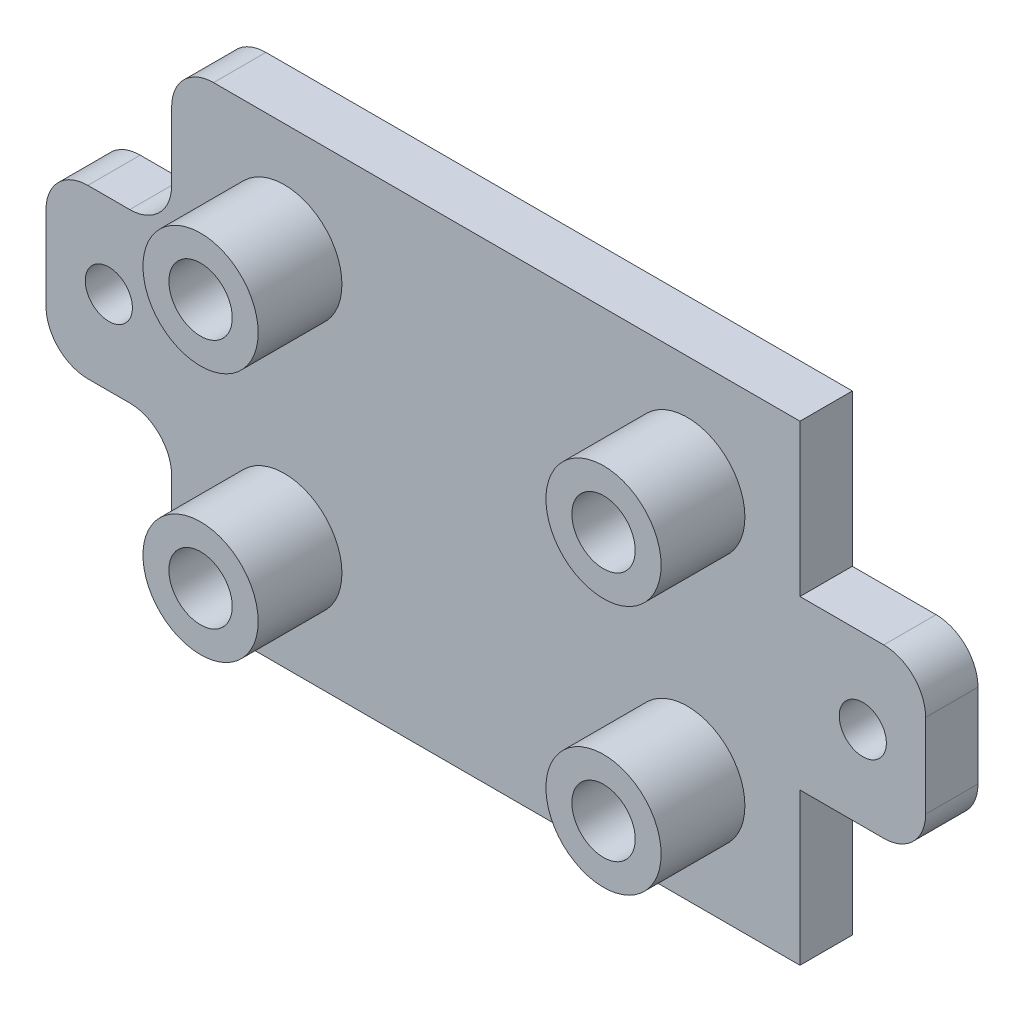
ISO-10303-21;
HEADER;
FILE_DESCRIPTION(('STEP AP214'),'2;1');
FILE_NAME('part.step','',(''),(''),'','','');
FILE_SCHEMA(('AUTOMOTIVE_DESIGN { 1 0 10303 214 1 1 1 1 }'));
ENDSEC;
DATA;
#1=APPLICATION_CONTEXT('core data for automotive mechanical design processes');
#2=APPLICATION_PROTOCOL_DEFINITION('international standard','automotive_design',2000,#1);
#3=PRODUCT_CONTEXT('',#1,'mechanical');
#4=PRODUCT('Part','Part','',(#3));
#5=PRODUCT_RELATED_PRODUCT_CATEGORY('part','',(#4));
#6=PRODUCT_DEFINITION_FORMATION('','',#4);
#7=PRODUCT_DEFINITION_CONTEXT('part definition',#1,'design');
#8=PRODUCT_DEFINITION('design','',#6,#7);
#9=PRODUCT_DEFINITION_SHAPE('','',#8);
#10=(LENGTH_UNIT() NAMED_UNIT(*) SI_UNIT(.MILLI.,.METRE.));
#11=(NAMED_UNIT(*) PLANE_ANGLE_UNIT() SI_UNIT($,.RADIAN.));
#12=(NAMED_UNIT(*) SI_UNIT($,.STERADIAN.) SOLID_ANGLE_UNIT());
#13=UNCERTAINTY_MEASURE_WITH_UNIT(LENGTH_MEASURE(1.E-05),#10,'distance_accuracy_value','');
#14=(GEOMETRIC_REPRESENTATION_CONTEXT(3) GLOBAL_UNCERTAINTY_ASSIGNED_CONTEXT((#13)) GLOBAL_UNIT_ASSIGNED_CONTEXT((#10,
#11,#12)) REPRESENTATION_CONTEXT('',''));
#15=CARTESIAN_POINT('',(0.,0.,0.));
#16=DIRECTION('',(0.,0.,1.));
#17=DIRECTION('',(1.,0.,0.));
#18=AXIS2_PLACEMENT_3D('',#15,#16,#17);
#19=CARTESIAN_POINT('',(30.,-22.5,5.));
#20=DIRECTION('',(-1.,0.,0.));
#21=DIRECTION('',(0.,0.,1.));
#22=AXIS2_PLACEMENT_3D('',#19,#20,#21);
#23=PLANE('',#22);
#24=DIRECTION('',(0.,0.,1.));
#25=VECTOR('',#24,1.);
#26=CARTESIAN_POINT('',(30.,8.00000000000037,0.));
#27=LINE('',#26,#25);
#28=CARTESIAN_POINT('',(30.,8.00000000000037,0.));
#29=VERTEX_POINT('',#28);
#30=CARTESIAN_POINT('',(30.,8.00000000000037,5.));
#31=VERTEX_POINT('',#30);
#32=EDGE_CURVE('E173',#29,#31,#27,.T.);
#33=ORIENTED_EDGE('',*,*,#32,.F.);
#34=DIRECTION('',(0.,1.,0.));
#35=VECTOR('',#34,1.);
#36=CARTESIAN_POINT('',(30.,-22.5,0.));
#37=LINE('',#36,#35);
#38=CARTESIAN_POINT('',(30.,22.5,0.));
#39=VERTEX_POINT('',#38);
#40=EDGE_CURVE('E182',#29,#39,#37,.T.);
#41=ORIENTED_EDGE('',*,*,#40,.T.);
#42=DIRECTION('',(0.,0.,-1.));
#43=VECTOR('',#42,1.);
#44=CARTESIAN_POINT('',(30.,22.5,5.));
#45=LINE('',#44,#43);
#46=CARTESIAN_POINT('',(30.,22.5,5.));
#47=VERTEX_POINT('',#46);
#48=EDGE_CURVE('E201',#47,#39,#45,.T.);
#49=ORIENTED_EDGE('',*,*,#48,.F.);
#50=DIRECTION('',(0.,1.,0.));
#51=VECTOR('',#50,1.);
#52=CARTESIAN_POINT('',(30.,-22.5,5.));
#53=LINE('',#52,#51);
#54=EDGE_CURVE('E184',#31,#47,#53,.T.);
#55=ORIENTED_EDGE('',*,*,#54,.F.);
#56=EDGE_LOOP('',(#33,#41,#49,#55));
#57=FACE_BOUND('',#56,.T.);
#58=ADVANCED_FACE('F33',(#57),#23,.F.);
#59=CARTESIAN_POINT('',(-30.,-22.5,5.));
#60=DIRECTION('',(1.,0.,0.));
#61=DIRECTION('',(0.,0.,-1.));
#62=AXIS2_PLACEMENT_3D('',#59,#60,#61);
#63=PLANE('',#62);
#64=DIRECTION('',(0.,-1.,0.));
#65=VECTOR('',#64,1.);
#66=CARTESIAN_POINT('',(-30.,-22.5,0.));
#67=LINE('',#66,#65);
#68=CARTESIAN_POINT('',(-30.,-11.9999999999997,0.));
#69=VERTEX_POINT('',#68);
#70=CARTESIAN_POINT('',(-30.,-18.5,0.));
#71=VERTEX_POINT('',#70);
#72=EDGE_CURVE('E364',#69,#71,#67,.T.);
#73=ORIENTED_EDGE('',*,*,#72,.T.);
#74=DIRECTION('',(0.,0.,-1.));
#75=VECTOR('',#74,1.);
#76=CARTESIAN_POINT('',(-30.,-18.5,5.));
#77=LINE('',#76,#75);
#78=CARTESIAN_POINT('',(-30.,-18.5,5.));
#79=VERTEX_POINT('',#78);
#80=EDGE_CURVE('E232',#71,#79,#77,.F.);
#81=ORIENTED_EDGE('',*,*,#80,.T.);
#82=DIRECTION('',(0.,-1.,0.));
#83=VECTOR('',#82,1.);
#84=CARTESIAN_POINT('',(-30.,-22.5,5.));
#85=LINE('',#84,#83);
#86=CARTESIAN_POINT('',(-30.,-11.9999999999997,5.));
#87=VERTEX_POINT('',#86);
#88=EDGE_CURVE('E200',#87,#79,#85,.T.);
#89=ORIENTED_EDGE('',*,*,#88,.F.);
#90=DIRECTION('',(0.,0.,1.));
#91=VECTOR('',#90,1.);
#92=CARTESIAN_POINT('',(-30.,-11.9999999999997,5.));
#93=LINE('',#92,#91);
#94=EDGE_CURVE('E230',#87,#69,#93,.F.);
#95=ORIENTED_EDGE('',*,*,#94,.T.);
#96=EDGE_LOOP('',(#73,#81,#89,#95));
#97=FACE_BOUND('',#96,.T.);
#98=ADVANCED_FACE('F421',(#97),#63,.F.);
#99=CARTESIAN_POINT('',(-30.,18.5,5.));
#100=VERTEX_POINT('',#99);
#101=CARTESIAN_POINT('',(-30.,12.0000000000005,5.));
#102=VERTEX_POINT('',#101);
#103=EDGE_CURVE('E367',#100,#102,#85,.T.);
#104=ORIENTED_EDGE('',*,*,#103,.F.);
#105=DIRECTION('',(0.,0.,-1.));
#106=VECTOR('',#105,1.);
#107=CARTESIAN_POINT('',(-30.,18.5,5.));
#108=LINE('',#107,#106);
#109=CARTESIAN_POINT('',(-30.,18.5,0.));
#110=VERTEX_POINT('',#109);
#111=EDGE_CURVE('E250',#100,#110,#108,.T.);
#112=ORIENTED_EDGE('',*,*,#111,.T.);
#113=CARTESIAN_POINT('',(-30.,12.0000000000005,0.));
#114=VERTEX_POINT('',#113);
#115=EDGE_CURVE('E195',#110,#114,#67,.T.);
#116=ORIENTED_EDGE('',*,*,#115,.T.);
#117=DIRECTION('',(0.,0.,1.));
#118=VECTOR('',#117,1.);
#119=CARTESIAN_POINT('',(-30.,12.0000000000005,5.));
#120=LINE('',#119,#118);
#121=EDGE_CURVE('E247',#114,#102,#120,.T.);
#122=ORIENTED_EDGE('',*,*,#121,.T.);
#123=EDGE_LOOP('',(#104,#112,#116,#122));
#124=FACE_BOUND('',#123,.T.);
#125=ADVANCED_FACE('F385',(#124),#63,.F.);
#126=CARTESIAN_POINT('',(30.,-22.5,5.));
#127=DIRECTION('',(0.,1.,0.));
#128=DIRECTION('',(-1.,0.,0.));
#129=AXIS2_PLACEMENT_3D('',#126,#127,#128);
#130=PLANE('',#129);
#131=DIRECTION('',(1.,0.,0.));
#132=VECTOR('',#131,1.);
#133=CARTESIAN_POINT('',(30.,-22.5,5.));
#134=LINE('',#133,#132);
#135=CARTESIAN_POINT('',(-26.,-22.5,5.));
#136=VERTEX_POINT('',#135);
#137=CARTESIAN_POINT('',(30.,-22.5,5.));
#138=VERTEX_POINT('',#137);
#139=EDGE_CURVE('E370',#136,#138,#134,.T.);
#140=ORIENTED_EDGE('',*,*,#139,.F.);
#141=DIRECTION('',(0.,0.,-1.));
#142=VECTOR('',#141,1.);
#143=CARTESIAN_POINT('',(-26.,-22.5,5.));
#144=LINE('',#143,#142);
#145=CARTESIAN_POINT('',(-26.,-22.5,0.));
#146=VERTEX_POINT('',#145);
#147=EDGE_CURVE('E219',#136,#146,#144,.T.);
#148=ORIENTED_EDGE('',*,*,#147,.T.);
#149=DIRECTION('',(1.,0.,0.));
#150=VECTOR('',#149,1.);
#151=CARTESIAN_POINT('',(30.,-22.5,0.));
#152=LINE('',#151,#150);
#153=CARTESIAN_POINT('',(30.,-22.5,0.));
#154=VERTEX_POINT('',#153);
#155=EDGE_CURVE('E192',#146,#154,#152,.T.);
#156=ORIENTED_EDGE('',*,*,#155,.T.);
#157=DIRECTION('',(0.,0.,-1.));
#158=VECTOR('',#157,1.);
#159=CARTESIAN_POINT('',(30.,-22.5,5.));
#160=LINE('',#159,#158);
#161=EDGE_CURVE('E203',#138,#154,#160,.T.);
#162=ORIENTED_EDGE('',*,*,#161,.F.);
#163=EDGE_LOOP('',(#140,#148,#156,#162));
#164=FACE_BOUND('',#163,.T.);
#165=ADVANCED_FACE('F428',(#164),#130,.F.);
#166=CARTESIAN_POINT('',(30.,-7.99999999999963,0.));
#167=VERTEX_POINT('',#166);
#168=EDGE_CURVE('E191',#154,#167,#37,.T.);
#169=ORIENTED_EDGE('',*,*,#168,.T.);
#170=DIRECTION('',(0.,0.,1.));
#171=VECTOR('',#170,1.);
#172=CARTESIAN_POINT('',(30.,-7.99999999999963,0.));
#173=LINE('',#172,#171);
#174=CARTESIAN_POINT('',(30.,-7.99999999999964,5.));
#175=VERTEX_POINT('',#174);
#176=EDGE_CURVE('E185',#167,#175,#173,.T.);
#177=ORIENTED_EDGE('',*,*,#176,.T.);
#178=EDGE_CURVE('E372',#138,#175,#53,.T.);
#179=ORIENTED_EDGE('',*,*,#178,.F.);
#180=ORIENTED_EDGE('',*,*,#161,.T.);
#181=EDGE_LOOP('',(#169,#177,#179,#180));
#182=FACE_BOUND('',#181,.T.);
#183=ADVANCED_FACE('F433',(#182),#23,.F.);
#184=CARTESIAN_POINT('',(30.,22.5,5.));
#185=DIRECTION('',(0.,-1.,0.));
#186=DIRECTION('',(1.,0.,0.));
#187=AXIS2_PLACEMENT_3D('',#184,#185,#186);
#188=PLANE('',#187);
#189=DIRECTION('',(-1.,0.,0.));
#190=VECTOR('',#189,1.);
#191=CARTESIAN_POINT('',(30.,22.5,0.));
#192=LINE('',#191,#190);
#193=CARTESIAN_POINT('',(-26.,22.5,0.));
#194=VERTEX_POINT('',#193);
#195=EDGE_CURVE('E190',#39,#194,#192,.T.);
#196=ORIENTED_EDGE('',*,*,#195,.T.);
#197=DIRECTION('',(0.,0.,-1.));
#198=VECTOR('',#197,1.);
#199=CARTESIAN_POINT('',(-26.,22.5,5.));
#200=LINE('',#199,#198);
#201=CARTESIAN_POINT('',(-26.,22.5,5.));
#202=VERTEX_POINT('',#201);
#203=EDGE_CURVE('E253',#194,#202,#200,.F.);
#204=ORIENTED_EDGE('',*,*,#203,.T.);
#205=DIRECTION('',(-1.,0.,0.));
#206=VECTOR('',#205,1.);
#207=CARTESIAN_POINT('',(30.,22.5,5.));
#208=LINE('',#207,#206);
#209=EDGE_CURVE('E204',#47,#202,#208,.T.);
#210=ORIENTED_EDGE('',*,*,#209,.F.);
#211=ORIENTED_EDGE('',*,*,#48,.T.);
#212=EDGE_LOOP('',(#196,#204,#210,#211));
#213=FACE_BOUND('',#212,.T.);
#214=ADVANCED_FACE('F457',(#213),#188,.F.);
#215=CARTESIAN_POINT('',(0.,0.,5.));
#216=DIRECTION('',(0.,0.,1.));
#217=DIRECTION('',(1.,0.,0.));
#218=AXIS2_PLACEMENT_3D('',#215,#216,#217);
#219=PLANE('',#218);
#220=CARTESIAN_POINT('',(36.,0.,5.));
#221=DIRECTION('',(0.,0.,1.));
#222=DIRECTION('',(1.,0.,0.));
#223=AXIS2_PLACEMENT_3D('',#220,#221,#222);
#224=CIRCLE('',#223,2.24999999999999);
#225=CARTESIAN_POINT('',(38.25,0.,5.));
#226=VERTEX_POINT('',#225);
#227=EDGE_CURVE('E562',#226,#226,#224,.T.);
#228=ORIENTED_EDGE('',*,*,#227,.F.);
#229=EDGE_LOOP('',(#228));
#230=FACE_BOUND('',#229,.T.);
#231=CARTESIAN_POINT('',(-36.,0.,5.));
#232=DIRECTION('',(0.,0.,1.));
#233=DIRECTION('',(1.,0.,0.));
#234=AXIS2_PLACEMENT_3D('',#231,#232,#233);
#235=CIRCLE('',#234,2.24999999999999);
#236=CARTESIAN_POINT('',(-33.75,0.,5.));
#237=VERTEX_POINT('',#236);
#238=EDGE_CURVE('E305',#237,#237,#235,.T.);
#239=ORIENTED_EDGE('',*,*,#238,.F.);
#240=EDGE_LOOP('',(#239));
#241=FACE_BOUND('',#240,.T.);
#242=CARTESIAN_POINT('',(19.2405,-11.938,5.));
#243=DIRECTION('',(0.,0.,1.));
#244=DIRECTION('',(1.,0.,0.));
#245=AXIS2_PLACEMENT_3D('',#242,#243,#244);
#246=CIRCLE('',#245,5.5);
#247=CARTESIAN_POINT('',(24.7405,-11.938,5.));
#248=VERTEX_POINT('',#247);
#249=EDGE_CURVE('E333',#248,#248,#246,.T.);
#250=ORIENTED_EDGE('',*,*,#249,.F.);
#251=EDGE_LOOP('',(#250));
#252=FACE_BOUND('',#251,.T.);
#253=CARTESIAN_POINT('',(19.2405,11.938,5.));
#254=DIRECTION('',(0.,0.,1.));
#255=DIRECTION('',(1.,0.,0.));
#256=AXIS2_PLACEMENT_3D('',#253,#254,#255);
#257=CIRCLE('',#256,5.5);
#258=CARTESIAN_POINT('',(24.7405,11.938,5.));
#259=VERTEX_POINT('',#258);
#260=EDGE_CURVE('E342',#259,#259,#257,.T.);
#261=ORIENTED_EDGE('',*,*,#260,.F.);
#262=EDGE_LOOP('',(#261));
#263=FACE_BOUND('',#262,.T.);
#264=CARTESIAN_POINT('',(-19.2405,-11.938,5.));
#265=DIRECTION('',(0.,0.,1.));
#266=DIRECTION('',(1.,0.,0.));
#267=AXIS2_PLACEMENT_3D('',#264,#265,#266);
#268=CIRCLE('',#267,5.5);
#269=CARTESIAN_POINT('',(-13.7405,-11.938,5.));
#270=VERTEX_POINT('',#269);
#271=EDGE_CURVE('E351',#270,#270,#268,.T.);
#272=ORIENTED_EDGE('',*,*,#271,.F.);
#273=EDGE_LOOP('',(#272));
#274=FACE_BOUND('',#273,.T.);
#275=CARTESIAN_POINT('',(-19.2405,11.938,5.));
#276=DIRECTION('',(0.,0.,1.));
#277=DIRECTION('',(1.,0.,0.));
#278=AXIS2_PLACEMENT_3D('',#275,#276,#277);
#279=CIRCLE('',#278,5.5);
#280=CARTESIAN_POINT('',(-13.7405,11.938,5.));
#281=VERTEX_POINT('',#280);
#282=EDGE_CURVE('E360',#281,#281,#279,.T.);
#283=ORIENTED_EDGE('',*,*,#282,.F.);
#284=EDGE_LOOP('',(#283));
#285=FACE_BOUND('',#284,.T.);
#286=DIRECTION('',(0.,-1.,0.));
#287=VECTOR('',#286,1.);
#288=CARTESIAN_POINT('',(42.,3.60822483003176E-13,5.));
#289=LINE('',#288,#287);
#290=CARTESIAN_POINT('',(42.,4.0000000000005,5.));
#291=VERTEX_POINT('',#290);
#292=CARTESIAN_POINT('',(42.,-3.99999999999966,5.));
#293=VERTEX_POINT('',#292);
#294=EDGE_CURVE('E297',#291,#293,#289,.T.);
#295=ORIENTED_EDGE('',*,*,#294,.F.);
#296=CARTESIAN_POINT('',(38.,4.00000000000053,5.));
#297=DIRECTION('',(0.,0.,1.));
#298=DIRECTION('',(1.,0.,0.));
#299=AXIS2_PLACEMENT_3D('',#296,#297,#298);
#300=CIRCLE('',#299,4.);
#301=CARTESIAN_POINT('',(37.9999999999999,8.00000000000053,5.00000000000009));
#302=VERTEX_POINT('',#301);
#303=EDGE_CURVE('E280',#291,#302,#300,.T.);
#304=ORIENTED_EDGE('',*,*,#303,.T.);
#305=DIRECTION('',(-0.999999999999999,0.,0.));
#306=VECTOR('',#305,1.);
#307=CARTESIAN_POINT('',(0.,8.00000000000037,5.));
#308=LINE('',#307,#306);
#309=EDGE_CURVE('E296',#302,#31,#308,.T.);
#310=ORIENTED_EDGE('',*,*,#309,.T.);
#311=ORIENTED_EDGE('',*,*,#54,.T.);
#312=ORIENTED_EDGE('',*,*,#209,.T.);
#313=CARTESIAN_POINT('',(-26.,18.5,5.));
#314=DIRECTION('',(0.,0.,1.));
#315=DIRECTION('',(1.,0.,0.));
#316=AXIS2_PLACEMENT_3D('',#313,#314,#315);
#317=CIRCLE('',#316,4.);
#318=EDGE_CURVE('E238',#202,#100,#317,.T.);
#319=ORIENTED_EDGE('',*,*,#318,.T.);
#320=ORIENTED_EDGE('',*,*,#103,.T.);
#321=CARTESIAN_POINT('',(-34.,12.0000000000005,5.));
#322=DIRECTION('',(0.,0.,1.));
#323=DIRECTION('',(1.,0.,0.));
#324=AXIS2_PLACEMENT_3D('',#321,#322,#323);
#325=CIRCLE('',#324,4.);
#326=CARTESIAN_POINT('',(-33.9999999999999,8.00000000000051,5.00000000000008));
#327=VERTEX_POINT('',#326);
#328=EDGE_CURVE('E269',#102,#327,#325,.F.);
#329=ORIENTED_EDGE('',*,*,#328,.T.);
#330=DIRECTION('',(0.999999999999999,0.,0.));
#331=VECTOR('',#330,1.);
#332=CARTESIAN_POINT('',(0.,8.00000000000037,5.));
#333=LINE('',#332,#331);
#334=CARTESIAN_POINT('',(-37.9999999999999,8.00000000000053,5.00000000000009));
#335=VERTEX_POINT('',#334);
#336=EDGE_CURVE('E317',#335,#327,#333,.T.);
#337=ORIENTED_EDGE('',*,*,#336,.F.);
#338=CARTESIAN_POINT('',(-38.,4.00000000000053,5.));
#339=DIRECTION('',(0.,0.,1.));
#340=DIRECTION('',(1.,0.,0.));
#341=AXIS2_PLACEMENT_3D('',#338,#339,#340);
#342=CIRCLE('',#341,4.);
#343=CARTESIAN_POINT('',(-42.,4.0000000000005,5.));
#344=VERTEX_POINT('',#343);
#345=EDGE_CURVE('E236',#335,#344,#342,.T.);
#346=ORIENTED_EDGE('',*,*,#345,.T.);
#347=DIRECTION('',(0.,-1.,0.));
#348=VECTOR('',#347,1.);
#349=CARTESIAN_POINT('',(-42.,3.60822483003176E-13,5.));
#350=LINE('',#349,#348);
#351=CARTESIAN_POINT('',(-42.,-3.99999999999966,5.));
#352=VERTEX_POINT('',#351);
#353=EDGE_CURVE('E312',#344,#352,#350,.T.);
#354=ORIENTED_EDGE('',*,*,#353,.T.);
#355=CARTESIAN_POINT('',(-38.,-3.99999999999965,5.));
#356=DIRECTION('',(0.,0.,1.));
#357=DIRECTION('',(1.,0.,0.));
#358=AXIS2_PLACEMENT_3D('',#355,#356,#357);
#359=CIRCLE('',#358,4.);
#360=CARTESIAN_POINT('',(-37.9999999999999,-7.99999999999965,5.00000000000009));
#361=VERTEX_POINT('',#360);
#362=EDGE_CURVE('E234',#352,#361,#359,.T.);
#363=ORIENTED_EDGE('',*,*,#362,.T.);
#364=DIRECTION('',(0.999999999999999,0.,0.));
#365=VECTOR('',#364,1.);
#366=CARTESIAN_POINT('',(0.,-7.99999999999981,5.));
#367=LINE('',#366,#365);
#368=CARTESIAN_POINT('',(-33.9999999999999,-7.99999999999967,5.00000000000008));
#369=VERTEX_POINT('',#368);
#370=EDGE_CURVE('E326',#361,#369,#367,.T.);
#371=ORIENTED_EDGE('',*,*,#370,.T.);
#372=CARTESIAN_POINT('',(-34.,-11.9999999999997,5.));
#373=DIRECTION('',(0.,0.,1.));
#374=DIRECTION('',(1.,0.,0.));
#375=AXIS2_PLACEMENT_3D('',#372,#373,#374);
#376=CIRCLE('',#375,4.);
#377=EDGE_CURVE('E265',#369,#87,#376,.F.);
#378=ORIENTED_EDGE('',*,*,#377,.T.);
#379=ORIENTED_EDGE('',*,*,#88,.T.);
#380=CARTESIAN_POINT('',(-26.,-18.5,5.));
#381=DIRECTION('',(0.,0.,1.));
#382=DIRECTION('',(1.,0.,0.));
#383=AXIS2_PLACEMENT_3D('',#380,#381,#382);
#384=CIRCLE('',#383,4.);
#385=EDGE_CURVE('E240',#79,#136,#384,.T.);
#386=ORIENTED_EDGE('',*,*,#385,.T.);
#387=ORIENTED_EDGE('',*,*,#139,.T.);
#388=ORIENTED_EDGE('',*,*,#178,.T.);
#389=DIRECTION('',(-0.999999999999999,0.,0.));
#390=VECTOR('',#389,1.);
#391=CARTESIAN_POINT('',(0.,-7.99999999999981,5.));
#392=LINE('',#391,#390);
#393=CARTESIAN_POINT('',(37.9999999999999,-7.99999999999965,5.00000000000009));
#394=VERTEX_POINT('',#393);
#395=EDGE_CURVE('E291',#394,#175,#392,.T.);
#396=ORIENTED_EDGE('',*,*,#395,.F.);
#397=CARTESIAN_POINT('',(38.,-3.99999999999965,5.));
#398=DIRECTION('',(0.,0.,1.));
#399=DIRECTION('',(1.,0.,0.));
#400=AXIS2_PLACEMENT_3D('',#397,#398,#399);
#401=CIRCLE('',#400,4.);
#402=EDGE_CURVE('E278',#394,#293,#401,.T.);
#403=ORIENTED_EDGE('',*,*,#402,.T.);
#404=EDGE_LOOP('',(#295,#304,#310,#311,#312,#319,#320,#329,#337,#346,#354,#363,#371,#378,#379,
#386,#387,#388,#396,#403));
#405=FACE_BOUND('',#404,.T.);
#406=ADVANCED_FACE('F295',(#230,#241,#252,#263,#274,#285,#405),#219,.T.);
#407=CARTESIAN_POINT('',(0.,0.,0.));
#408=DIRECTION('',(0.,0.,1.));
#409=DIRECTION('',(1.,0.,0.));
#410=AXIS2_PLACEMENT_3D('',#407,#408,#409);
#411=PLANE('',#410);
#412=CARTESIAN_POINT('',(36.,0.,0.));
#413=DIRECTION('',(0.,0.,1.));
#414=DIRECTION('',(1.,0.,0.));
#415=AXIS2_PLACEMENT_3D('',#412,#413,#414);
#416=CIRCLE('',#415,2.25);
#417=CARTESIAN_POINT('',(38.25,0.,0.));
#418=VERTEX_POINT('',#417);
#419=EDGE_CURVE('E300',#418,#418,#416,.T.);
#420=ORIENTED_EDGE('',*,*,#419,.T.);
#421=EDGE_LOOP('',(#420));
#422=FACE_BOUND('',#421,.T.);
#423=CARTESIAN_POINT('',(-36.,0.,0.));
#424=DIRECTION('',(0.,0.,1.));
#425=DIRECTION('',(1.,0.,0.));
#426=AXIS2_PLACEMENT_3D('',#423,#424,#425);
#427=CIRCLE('',#426,2.25);
#428=CARTESIAN_POINT('',(-33.75,0.,0.));
#429=VERTEX_POINT('',#428);
#430=EDGE_CURVE('E309',#429,#429,#427,.T.);
#431=ORIENTED_EDGE('',*,*,#430,.T.);
#432=EDGE_LOOP('',(#431));
#433=FACE_BOUND('',#432,.T.);
#434=DIRECTION('',(-0.999999999999999,0.,0.));
#435=VECTOR('',#434,1.);
#436=CARTESIAN_POINT('',(0.,8.00000000000037,0.));
#437=LINE('',#436,#435);
#438=CARTESIAN_POINT('',(37.9999999999999,8.00000000000053,0.));
#439=VERTEX_POINT('',#438);
#440=EDGE_CURVE('E170',#439,#29,#437,.T.);
#441=ORIENTED_EDGE('',*,*,#440,.F.);
#442=CARTESIAN_POINT('',(38.,4.00000000000053,0.));
#443=DIRECTION('',(0.,0.,1.));
#444=DIRECTION('',(1.,0.,0.));
#445=AXIS2_PLACEMENT_3D('',#442,#443,#444);
#446=CIRCLE('',#445,4.);
#447=CARTESIAN_POINT('',(42.,4.0000000000005,0.));
#448=VERTEX_POINT('',#447);
#449=EDGE_CURVE('E41',#439,#448,#446,.F.);
#450=ORIENTED_EDGE('',*,*,#449,.T.);
#451=DIRECTION('',(0.,-1.,0.));
#452=VECTOR('',#451,1.);
#453=CARTESIAN_POINT('',(42.,3.60822483003176E-13,0.));
#454=LINE('',#453,#452);
#455=CARTESIAN_POINT('',(42.,-3.99999999999966,0.));
#456=VERTEX_POINT('',#455);
#457=EDGE_CURVE('E178',#448,#456,#454,.T.);
#458=ORIENTED_EDGE('',*,*,#457,.T.);
#459=CARTESIAN_POINT('',(38.,-3.99999999999965,0.));
#460=DIRECTION('',(0.,0.,1.));
#461=DIRECTION('',(1.,0.,0.));
#462=AXIS2_PLACEMENT_3D('',#459,#460,#461);
#463=CIRCLE('',#462,4.);
#464=CARTESIAN_POINT('',(37.9999999999999,-7.99999999999965,0.));
#465=VERTEX_POINT('',#464);
#466=EDGE_CURVE('E48',#456,#465,#463,.F.);
#467=ORIENTED_EDGE('',*,*,#466,.T.);
#468=DIRECTION('',(-0.999999999999999,0.,0.));
#469=VECTOR('',#468,1.);
#470=CARTESIAN_POINT('',(0.,-7.99999999999981,0.));
#471=LINE('',#470,#469);
#472=EDGE_CURVE('E177',#465,#167,#471,.T.);
#473=ORIENTED_EDGE('',*,*,#472,.T.);
#474=ORIENTED_EDGE('',*,*,#168,.F.);
#475=ORIENTED_EDGE('',*,*,#155,.F.);
#476=CARTESIAN_POINT('',(-26.,-18.5,0.));
#477=DIRECTION('',(0.,0.,1.));
#478=DIRECTION('',(1.,0.,0.));
#479=AXIS2_PLACEMENT_3D('',#476,#477,#478);
#480=CIRCLE('',#479,4.);
#481=EDGE_CURVE('E228',#146,#71,#480,.F.);
#482=ORIENTED_EDGE('',*,*,#481,.T.);
#483=ORIENTED_EDGE('',*,*,#72,.F.);
#484=CARTESIAN_POINT('',(-34.,-11.9999999999997,0.));
#485=DIRECTION('',(0.,0.,1.));
#486=DIRECTION('',(1.,0.,0.));
#487=AXIS2_PLACEMENT_3D('',#484,#485,#486);
#488=CIRCLE('',#487,4.);
#489=CARTESIAN_POINT('',(-33.9999999999999,-7.99999999999967,0.));
#490=VERTEX_POINT('',#489);
#491=EDGE_CURVE('E267',#69,#490,#488,.T.);
#492=ORIENTED_EDGE('',*,*,#491,.T.);
#493=DIRECTION('',(0.999999999999999,0.,0.));
#494=VECTOR('',#493,1.);
#495=CARTESIAN_POINT('',(0.,-7.99999999999981,0.));
#496=LINE('',#495,#494);
#497=CARTESIAN_POINT('',(-37.9999999999999,-7.99999999999965,0.));
#498=VERTEX_POINT('',#497);
#499=EDGE_CURVE('E316',#498,#490,#496,.T.);
#500=ORIENTED_EDGE('',*,*,#499,.F.);
#501=CARTESIAN_POINT('',(-38.,-3.99999999999965,0.));
#502=DIRECTION('',(0.,0.,1.));
#503=DIRECTION('',(1.,0.,0.));
#504=AXIS2_PLACEMENT_3D('',#501,#502,#503);
#505=CIRCLE('',#504,4.);
#506=CARTESIAN_POINT('',(-42.,-3.99999999999966,0.));
#507=VERTEX_POINT('',#506);
#508=EDGE_CURVE('E222',#498,#507,#505,.F.);
#509=ORIENTED_EDGE('',*,*,#508,.T.);
#510=DIRECTION('',(0.,-1.,0.));
#511=VECTOR('',#510,1.);
#512=CARTESIAN_POINT('',(-42.,3.60822483003176E-13,0.));
#513=LINE('',#512,#511);
#514=CARTESIAN_POINT('',(-42.,4.0000000000005,0.));
#515=VERTEX_POINT('',#514);
#516=EDGE_CURVE('E313',#515,#507,#513,.T.);
#517=ORIENTED_EDGE('',*,*,#516,.F.);
#518=CARTESIAN_POINT('',(-38.,4.00000000000053,0.));
#519=DIRECTION('',(0.,0.,1.));
#520=DIRECTION('',(1.,0.,0.));
#521=AXIS2_PLACEMENT_3D('',#518,#519,#520);
#522=CIRCLE('',#521,4.);
#523=CARTESIAN_POINT('',(-37.9999999999999,8.00000000000053,0.));
#524=VERTEX_POINT('',#523);
#525=EDGE_CURVE('E224',#515,#524,#522,.F.);
#526=ORIENTED_EDGE('',*,*,#525,.T.);
#527=DIRECTION('',(0.999999999999999,0.,0.));
#528=VECTOR('',#527,1.);
#529=CARTESIAN_POINT('',(0.,8.00000000000037,0.));
#530=LINE('',#529,#528);
#531=CARTESIAN_POINT('',(-33.9999999999999,8.00000000000051,0.));
#532=VERTEX_POINT('',#531);
#533=EDGE_CURVE('E320',#524,#532,#530,.T.);
#534=ORIENTED_EDGE('',*,*,#533,.T.);
#535=CARTESIAN_POINT('',(-34.,12.0000000000005,0.));
#536=DIRECTION('',(0.,0.,1.));
#537=DIRECTION('',(1.,0.,0.));
#538=AXIS2_PLACEMENT_3D('',#535,#536,#537);
#539=CIRCLE('',#538,4.);
#540=EDGE_CURVE('E271',#532,#114,#539,.T.);
#541=ORIENTED_EDGE('',*,*,#540,.T.);
#542=ORIENTED_EDGE('',*,*,#115,.F.);
#543=CARTESIAN_POINT('',(-26.,18.5,0.));
#544=DIRECTION('',(0.,0.,1.));
#545=DIRECTION('',(1.,0.,0.));
#546=AXIS2_PLACEMENT_3D('',#543,#544,#545);
#547=CIRCLE('',#546,4.);
#548=EDGE_CURVE('E226',#110,#194,#547,.F.);
#549=ORIENTED_EDGE('',*,*,#548,.T.);
#550=ORIENTED_EDGE('',*,*,#195,.F.);
#551=ORIENTED_EDGE('',*,*,#40,.F.);
#552=EDGE_LOOP('',(#441,#450,#458,#467,#473,#474,#475,#482,#483,#492,#500,#509,#517,#526,#534,
#541,#542,#549,#550,#551));
#553=FACE_BOUND('',#552,.T.);
#554=ADVANCED_FACE('F188',(#422,#433,#553),#411,.F.);
#555=CARTESIAN_POINT('',(-19.2405,11.938,13.));
#556=DIRECTION('',(0.,0.,1.));
#557=DIRECTION('',(1.,0.,0.));
#558=AXIS2_PLACEMENT_3D('',#555,#556,#557);
#559=PLANE('',#558);
#560=CARTESIAN_POINT('',(-19.2405,11.938,13.));
#561=DIRECTION('',(0.,0.,1.));
#562=DIRECTION('',(1.,0.,0.));
#563=AXIS2_PLACEMENT_3D('',#560,#561,#562);
#564=CIRCLE('',#563,5.5);
#565=CARTESIAN_POINT('',(-13.7405,11.938,13.));
#566=VERTEX_POINT('',#565);
#567=EDGE_CURVE('E361',#566,#566,#564,.T.);
#568=ORIENTED_EDGE('',*,*,#567,.T.);
#569=EDGE_LOOP('',(#568));
#570=FACE_BOUND('',#569,.T.);
#571=CARTESIAN_POINT('',(-19.2405,11.938,13.));
#572=DIRECTION('',(0.,0.,1.));
#573=DIRECTION('',(1.,0.,0.));
#574=AXIS2_PLACEMENT_3D('',#571,#572,#573);
#575=CIRCLE('',#574,3.025);
#576=CARTESIAN_POINT('',(-16.2155,11.938,13.));
#577=VERTEX_POINT('',#576);
#578=EDGE_CURVE('E355',#577,#577,#575,.T.);
#579=ORIENTED_EDGE('',*,*,#578,.F.);
#580=EDGE_LOOP('',(#579));
#581=FACE_BOUND('',#580,.T.);
#582=ADVANCED_FACE('F545',(#570,#581),#559,.T.);
#583=CARTESIAN_POINT('',(-19.2405,11.938,13.));
#584=DIRECTION('',(0.,0.,-1.));
#585=DIRECTION('',(-1.,0.,0.));
#586=AXIS2_PLACEMENT_3D('',#583,#584,#585);
#587=CYLINDRICAL_SURFACE('',#586,5.5);
#588=ORIENTED_EDGE('',*,*,#567,.F.);
#589=EDGE_LOOP('',(#588));
#590=FACE_BOUND('',#589,.T.);
#591=ORIENTED_EDGE('',*,*,#282,.T.);
#592=EDGE_LOOP('',(#591));
#593=FACE_BOUND('',#592,.T.);
#594=ADVANCED_FACE('F543',(#590,#593),#587,.T.);
#595=CARTESIAN_POINT('',(-19.2405,11.938,13.));
#596=DIRECTION('',(0.,0.,-1.));
#597=DIRECTION('',(-1.,0.,0.));
#598=AXIS2_PLACEMENT_3D('',#595,#596,#597);
#599=CYLINDRICAL_SURFACE('',#598,3.025);
#600=ORIENTED_EDGE('',*,*,#578,.T.);
#601=EDGE_LOOP('',(#600));
#602=FACE_BOUND('',#601,.T.);
#603=CARTESIAN_POINT('',(-19.2405,11.938,5.));
#604=DIRECTION('',(0.,0.,1.));
#605=DIRECTION('',(1.,0.,0.));
#606=AXIS2_PLACEMENT_3D('',#603,#604,#605);
#607=CIRCLE('',#606,3.025);
#608=CARTESIAN_POINT('',(-16.2155,11.938,5.));
#609=VERTEX_POINT('',#608);
#610=EDGE_CURVE('E207',#609,#609,#607,.F.);
#611=ORIENTED_EDGE('',*,*,#610,.T.);
#612=EDGE_LOOP('',(#611));
#613=FACE_BOUND('',#612,.T.);
#614=ADVANCED_FACE('F540',(#602,#613),#599,.F.);
#615=ORIENTED_EDGE('',*,*,#610,.F.);
#616=EDGE_LOOP('',(#615));
#617=FACE_BOUND('',#616,.T.);
#618=ADVANCED_FACE('F535',(#617),#219,.T.);
#619=CARTESIAN_POINT('',(-19.2405,-11.938,13.));
#620=DIRECTION('',(0.,0.,1.));
#621=DIRECTION('',(1.,0.,0.));
#622=AXIS2_PLACEMENT_3D('',#619,#620,#621);
#623=PLANE('',#622);
#624=CARTESIAN_POINT('',(-19.2405,-11.938,13.));
#625=DIRECTION('',(0.,0.,1.));
#626=DIRECTION('',(1.,0.,0.));
#627=AXIS2_PLACEMENT_3D('',#624,#625,#626);
#628=CIRCLE('',#627,5.5);
#629=CARTESIAN_POINT('',(-13.7405,-11.938,13.));
#630=VERTEX_POINT('',#629);
#631=EDGE_CURVE('E352',#630,#630,#628,.T.);
#632=ORIENTED_EDGE('',*,*,#631,.T.);
#633=EDGE_LOOP('',(#632));
#634=FACE_BOUND('',#633,.T.);
#635=CARTESIAN_POINT('',(-19.2405,-11.938,13.));
#636=DIRECTION('',(0.,0.,1.));
#637=DIRECTION('',(1.,0.,0.));
#638=AXIS2_PLACEMENT_3D('',#635,#636,#637);
#639=CIRCLE('',#638,3.025);
#640=CARTESIAN_POINT('',(-16.2155,-11.938,13.));
#641=VERTEX_POINT('',#640);
#642=EDGE_CURVE('E346',#641,#641,#639,.T.);
#643=ORIENTED_EDGE('',*,*,#642,.F.);
#644=EDGE_LOOP('',(#643));
#645=FACE_BOUND('',#644,.T.);
#646=ADVANCED_FACE('F532',(#634,#645),#623,.T.);
#647=CARTESIAN_POINT('',(-19.2405,-11.938,13.));
#648=DIRECTION('',(0.,0.,-1.));
#649=DIRECTION('',(-1.,0.,0.));
#650=AXIS2_PLACEMENT_3D('',#647,#648,#649);
#651=CYLINDRICAL_SURFACE('',#650,5.5);
#652=ORIENTED_EDGE('',*,*,#631,.F.);
#653=EDGE_LOOP('',(#652));
#654=FACE_BOUND('',#653,.T.);
#655=ORIENTED_EDGE('',*,*,#271,.T.);
#656=EDGE_LOOP('',(#655));
#657=FACE_BOUND('',#656,.T.);
#658=ADVANCED_FACE('F530',(#654,#657),#651,.T.);
#659=CARTESIAN_POINT('',(-19.2405,-11.938,13.));
#660=DIRECTION('',(0.,0.,-1.));
#661=DIRECTION('',(-1.,0.,0.));
#662=AXIS2_PLACEMENT_3D('',#659,#660,#661);
#663=CYLINDRICAL_SURFACE('',#662,3.025);
#664=ORIENTED_EDGE('',*,*,#642,.T.);
#665=EDGE_LOOP('',(#664));
#666=FACE_BOUND('',#665,.T.);
#667=CARTESIAN_POINT('',(-19.2405,-11.938,5.));
#668=DIRECTION('',(0.,0.,1.));
#669=DIRECTION('',(1.,0.,0.));
#670=AXIS2_PLACEMENT_3D('',#667,#668,#669);
#671=CIRCLE('',#670,3.025);
#672=CARTESIAN_POINT('',(-16.2155,-11.938,5.));
#673=VERTEX_POINT('',#672);
#674=EDGE_CURVE('E210',#673,#673,#671,.F.);
#675=ORIENTED_EDGE('',*,*,#674,.T.);
#676=EDGE_LOOP('',(#675));
#677=FACE_BOUND('',#676,.T.);
#678=ADVANCED_FACE('F527',(#666,#677),#663,.F.);
#679=ORIENTED_EDGE('',*,*,#674,.F.);
#680=EDGE_LOOP('',(#679));
#681=FACE_BOUND('',#680,.T.);
#682=ADVANCED_FACE('F522',(#681),#219,.T.);
#683=CARTESIAN_POINT('',(19.2405,11.938,13.));
#684=DIRECTION('',(0.,0.,1.));
#685=DIRECTION('',(1.,0.,0.));
#686=AXIS2_PLACEMENT_3D('',#683,#684,#685);
#687=PLANE('',#686);
#688=CARTESIAN_POINT('',(19.2405,11.938,13.));
#689=DIRECTION('',(0.,0.,1.));
#690=DIRECTION('',(1.,0.,0.));
#691=AXIS2_PLACEMENT_3D('',#688,#689,#690);
#692=CIRCLE('',#691,5.5);
#693=CARTESIAN_POINT('',(24.7405,11.938,13.));
#694=VERTEX_POINT('',#693);
#695=EDGE_CURVE('E343',#694,#694,#692,.T.);
#696=ORIENTED_EDGE('',*,*,#695,.T.);
#697=EDGE_LOOP('',(#696));
#698=FACE_BOUND('',#697,.T.);
#699=CARTESIAN_POINT('',(19.2405,11.938,13.));
#700=DIRECTION('',(0.,0.,1.));
#701=DIRECTION('',(1.,0.,0.));
#702=AXIS2_PLACEMENT_3D('',#699,#700,#701);
#703=CIRCLE('',#702,3.025);
#704=CARTESIAN_POINT('',(22.2655,11.938,13.));
#705=VERTEX_POINT('',#704);
#706=EDGE_CURVE('E337',#705,#705,#703,.T.);
#707=ORIENTED_EDGE('',*,*,#706,.F.);
#708=EDGE_LOOP('',(#707));
#709=FACE_BOUND('',#708,.T.);
#710=ADVANCED_FACE('F519',(#698,#709),#687,.T.);
#711=CARTESIAN_POINT('',(19.2405,11.938,13.));
#712=DIRECTION('',(0.,0.,-1.));
#713=DIRECTION('',(-1.,0.,0.));
#714=AXIS2_PLACEMENT_3D('',#711,#712,#713);
#715=CYLINDRICAL_SURFACE('',#714,5.5);
#716=ORIENTED_EDGE('',*,*,#695,.F.);
#717=EDGE_LOOP('',(#716));
#718=FACE_BOUND('',#717,.T.);
#719=ORIENTED_EDGE('',*,*,#260,.T.);
#720=EDGE_LOOP('',(#719));
#721=FACE_BOUND('',#720,.T.);
#722=ADVANCED_FACE('F517',(#718,#721),#715,.T.);
#723=CARTESIAN_POINT('',(19.2405,11.938,13.));
#724=DIRECTION('',(0.,0.,-1.));
#725=DIRECTION('',(-1.,0.,0.));
#726=AXIS2_PLACEMENT_3D('',#723,#724,#725);
#727=CYLINDRICAL_SURFACE('',#726,3.025);
#728=ORIENTED_EDGE('',*,*,#706,.T.);
#729=EDGE_LOOP('',(#728));
#730=FACE_BOUND('',#729,.T.);
#731=CARTESIAN_POINT('',(19.2405,11.938,5.));
#732=DIRECTION('',(0.,0.,1.));
#733=DIRECTION('',(1.,0.,0.));
#734=AXIS2_PLACEMENT_3D('',#731,#732,#733);
#735=CIRCLE('',#734,3.025);
#736=CARTESIAN_POINT('',(22.2655,11.938,5.));
#737=VERTEX_POINT('',#736);
#738=EDGE_CURVE('E213',#737,#737,#735,.F.);
#739=ORIENTED_EDGE('',*,*,#738,.T.);
#740=EDGE_LOOP('',(#739));
#741=FACE_BOUND('',#740,.T.);
#742=ADVANCED_FACE('F514',(#730,#741),#727,.F.);
#743=ORIENTED_EDGE('',*,*,#738,.F.);
#744=EDGE_LOOP('',(#743));
#745=FACE_BOUND('',#744,.T.);
#746=ADVANCED_FACE('F509',(#745),#219,.T.);
#747=CARTESIAN_POINT('',(19.2405,-11.938,13.));
#748=DIRECTION('',(0.,0.,1.));
#749=DIRECTION('',(1.,0.,0.));
#750=AXIS2_PLACEMENT_3D('',#747,#748,#749);
#751=PLANE('',#750);
#752=CARTESIAN_POINT('',(19.2405,-11.938,13.));
#753=DIRECTION('',(0.,0.,1.));
#754=DIRECTION('',(1.,0.,0.));
#755=AXIS2_PLACEMENT_3D('',#752,#753,#754);
#756=CIRCLE('',#755,5.5);
#757=CARTESIAN_POINT('',(24.7405,-11.938,13.));
#758=VERTEX_POINT('',#757);
#759=EDGE_CURVE('E334',#758,#758,#756,.T.);
#760=ORIENTED_EDGE('',*,*,#759,.T.);
#761=EDGE_LOOP('',(#760));
#762=FACE_BOUND('',#761,.T.);
#763=CARTESIAN_POINT('',(19.2405,-11.938,13.));
#764=DIRECTION('',(0.,0.,1.));
#765=DIRECTION('',(1.,0.,0.));
#766=AXIS2_PLACEMENT_3D('',#763,#764,#765);
#767=CIRCLE('',#766,3.025);
#768=CARTESIAN_POINT('',(22.2655,-11.938,13.));
#769=VERTEX_POINT('',#768);
#770=EDGE_CURVE('E323',#769,#769,#767,.T.);
#771=ORIENTED_EDGE('',*,*,#770,.F.);
#772=EDGE_LOOP('',(#771));
#773=FACE_BOUND('',#772,.T.);
#774=ADVANCED_FACE('F506',(#762,#773),#751,.T.);
#775=CARTESIAN_POINT('',(19.2405,-11.938,13.));
#776=DIRECTION('',(0.,0.,-1.));
#777=DIRECTION('',(-1.,0.,0.));
#778=AXIS2_PLACEMENT_3D('',#775,#776,#777);
#779=CYLINDRICAL_SURFACE('',#778,5.5);
#780=ORIENTED_EDGE('',*,*,#759,.F.);
#781=EDGE_LOOP('',(#780));
#782=FACE_BOUND('',#781,.T.);
#783=ORIENTED_EDGE('',*,*,#249,.T.);
#784=EDGE_LOOP('',(#783));
#785=FACE_BOUND('',#784,.T.);
#786=ADVANCED_FACE('F504',(#782,#785),#779,.T.);
#787=CARTESIAN_POINT('',(19.2405,-11.938,13.));
#788=DIRECTION('',(0.,0.,-1.));
#789=DIRECTION('',(-1.,0.,0.));
#790=AXIS2_PLACEMENT_3D('',#787,#788,#789);
#791=CYLINDRICAL_SURFACE('',#790,3.025);
#792=ORIENTED_EDGE('',*,*,#770,.T.);
#793=EDGE_LOOP('',(#792));
#794=FACE_BOUND('',#793,.T.);
#795=CARTESIAN_POINT('',(19.2405,-11.938,5.));
#796=DIRECTION('',(0.,0.,1.));
#797=DIRECTION('',(1.,0.,0.));
#798=AXIS2_PLACEMENT_3D('',#795,#796,#797);
#799=CIRCLE('',#798,3.025);
#800=CARTESIAN_POINT('',(22.2655,-11.938,5.));
#801=VERTEX_POINT('',#800);
#802=EDGE_CURVE('E216',#801,#801,#799,.F.);
#803=ORIENTED_EDGE('',*,*,#802,.T.);
#804=EDGE_LOOP('',(#803));
#805=FACE_BOUND('',#804,.T.);
#806=ADVANCED_FACE('F501',(#794,#805),#791,.F.);
#807=ORIENTED_EDGE('',*,*,#802,.F.);
#808=EDGE_LOOP('',(#807));
#809=FACE_BOUND('',#808,.T.);
#810=ADVANCED_FACE('F500',(#809),#219,.T.);
#811=CARTESIAN_POINT('',(-42.,3.60822483003176E-13,0.));
#812=DIRECTION('',(-1.,0.,0.));
#813=DIRECTION('',(0.,-1.,0.));
#814=AXIS2_PLACEMENT_3D('',#811,#812,#813);
#815=PLANE('',#814);
#816=ORIENTED_EDGE('',*,*,#353,.F.);
#817=DIRECTION('',(0.,0.,1.));
#818=VECTOR('',#817,1.);
#819=CARTESIAN_POINT('',(-42.,4.00000000000051,0.));
#820=LINE('',#819,#818);
#821=EDGE_CURVE('E263',#344,#515,#820,.F.);
#822=ORIENTED_EDGE('',*,*,#821,.T.);
#823=ORIENTED_EDGE('',*,*,#516,.T.);
#824=DIRECTION('',(0.,0.,1.));
#825=VECTOR('',#824,1.);
#826=CARTESIAN_POINT('',(-42.,-3.99999999999967,0.));
#827=LINE('',#826,#825);
#828=EDGE_CURVE('E260',#507,#352,#827,.T.);
#829=ORIENTED_EDGE('',*,*,#828,.T.);
#830=EDGE_LOOP('',(#816,#822,#823,#829));
#831=FACE_BOUND('',#830,.T.);
#832=ADVANCED_FACE('F402',(#831),#815,.T.);
#833=CARTESIAN_POINT('',(0.,8.00000000000037,0.));
#834=DIRECTION('',(0.,-1.,0.));
#835=DIRECTION('',(1.,0.,0.));
#836=AXIS2_PLACEMENT_3D('',#833,#834,#835);
#837=PLANE('',#836);
#838=ORIENTED_EDGE('',*,*,#336,.T.);
#839=DIRECTION('',(0.,0.,1.));
#840=VECTOR('',#839,1.);
#841=CARTESIAN_POINT('',(-34.,8.00000000000051,0.));
#842=LINE('',#841,#840);
#843=EDGE_CURVE('E258',#327,#532,#842,.F.);
#844=ORIENTED_EDGE('',*,*,#843,.T.);
#845=ORIENTED_EDGE('',*,*,#533,.F.);
#846=DIRECTION('',(0.,0.,1.));
#847=VECTOR('',#846,1.);
#848=CARTESIAN_POINT('',(-38.,8.00000000000053,5.));
#849=LINE('',#848,#847);
#850=EDGE_CURVE('E255',#524,#335,#849,.T.);
#851=ORIENTED_EDGE('',*,*,#850,.T.);
#852=EDGE_LOOP('',(#838,#844,#845,#851));
#853=FACE_BOUND('',#852,.T.);
#854=ADVANCED_FACE('F393',(#853),#837,.F.);
#855=CARTESIAN_POINT('',(0.,-7.99999999999981,0.));
#856=DIRECTION('',(0.,-1.,0.));
#857=DIRECTION('',(1.,0.,0.));
#858=AXIS2_PLACEMENT_3D('',#855,#856,#857);
#859=PLANE('',#858);
#860=ORIENTED_EDGE('',*,*,#499,.T.);
#861=DIRECTION('',(0.,0.,1.));
#862=VECTOR('',#861,1.);
#863=CARTESIAN_POINT('',(-34.,-7.99999999999967,0.));
#864=LINE('',#863,#862);
#865=EDGE_CURVE('E244',#490,#369,#864,.T.);
#866=ORIENTED_EDGE('',*,*,#865,.T.);
#867=ORIENTED_EDGE('',*,*,#370,.F.);
#868=DIRECTION('',(0.,0.,1.));
#869=VECTOR('',#868,1.);
#870=CARTESIAN_POINT('',(-38.,-7.99999999999965,0.));
#871=LINE('',#870,#869);
#872=EDGE_CURVE('E242',#361,#498,#871,.F.);
#873=ORIENTED_EDGE('',*,*,#872,.T.);
#874=EDGE_LOOP('',(#860,#866,#867,#873));
#875=FACE_BOUND('',#874,.T.);
#876=ADVANCED_FACE('F411',(#875),#859,.T.);
#877=CARTESIAN_POINT('',(-26.,-18.5,5.));
#878=DIRECTION('',(0.,0.,-1.));
#879=DIRECTION('',(-1.,0.,0.));
#880=AXIS2_PLACEMENT_3D('',#877,#878,#879);
#881=CYLINDRICAL_SURFACE('',#880,4.);
#882=ORIENTED_EDGE('',*,*,#385,.F.);
#883=ORIENTED_EDGE('',*,*,#80,.F.);
#884=ORIENTED_EDGE('',*,*,#481,.F.);
#885=ORIENTED_EDGE('',*,*,#147,.F.);
#886=EDGE_LOOP('',(#882,#883,#884,#885));
#887=FACE_BOUND('',#886,.T.);
#888=ADVANCED_FACE('F423',(#887),#881,.T.);
#889=CARTESIAN_POINT('',(-34.,-11.9999999999997,0.));
#890=DIRECTION('',(0.,0.,1.));
#891=DIRECTION('',(1.,0.,0.));
#892=AXIS2_PLACEMENT_3D('',#889,#890,#891);
#893=CYLINDRICAL_SURFACE('',#892,4.);
#894=ORIENTED_EDGE('',*,*,#491,.F.);
#895=ORIENTED_EDGE('',*,*,#94,.F.);
#896=ORIENTED_EDGE('',*,*,#377,.F.);
#897=ORIENTED_EDGE('',*,*,#865,.F.);
#898=EDGE_LOOP('',(#894,#895,#896,#897));
#899=FACE_BOUND('',#898,.T.);
#900=ADVANCED_FACE('F416',(#899),#893,.F.);
#901=CARTESIAN_POINT('',(-26.,18.5,5.));
#902=DIRECTION('',(0.,0.,-1.));
#903=DIRECTION('',(-1.,0.,0.));
#904=AXIS2_PLACEMENT_3D('',#901,#902,#903);
#905=CYLINDRICAL_SURFACE('',#904,4.);
#906=ORIENTED_EDGE('',*,*,#318,.F.);
#907=ORIENTED_EDGE('',*,*,#203,.F.);
#908=ORIENTED_EDGE('',*,*,#548,.F.);
#909=ORIENTED_EDGE('',*,*,#111,.F.);
#910=EDGE_LOOP('',(#906,#907,#908,#909));
#911=FACE_BOUND('',#910,.T.);
#912=ADVANCED_FACE('F471',(#911),#905,.T.);
#913=CARTESIAN_POINT('',(-34.,12.0000000000005,5.));
#914=DIRECTION('',(0.,0.,-1.));
#915=DIRECTION('',(-1.,0.,0.));
#916=AXIS2_PLACEMENT_3D('',#913,#914,#915);
#917=CYLINDRICAL_SURFACE('',#916,4.);
#918=ORIENTED_EDGE('',*,*,#540,.F.);
#919=ORIENTED_EDGE('',*,*,#843,.F.);
#920=ORIENTED_EDGE('',*,*,#328,.F.);
#921=ORIENTED_EDGE('',*,*,#121,.F.);
#922=EDGE_LOOP('',(#918,#919,#920,#921));
#923=FACE_BOUND('',#922,.T.);
#924=ADVANCED_FACE('F389',(#923),#917,.F.);
#925=CARTESIAN_POINT('',(-38.,4.00000000000053,0.));
#926=DIRECTION('',(0.,0.,-1.));
#927=DIRECTION('',(-1.,0.,0.));
#928=AXIS2_PLACEMENT_3D('',#925,#926,#927);
#929=CYLINDRICAL_SURFACE('',#928,4.);
#930=ORIENTED_EDGE('',*,*,#525,.F.);
#931=ORIENTED_EDGE('',*,*,#821,.F.);
#932=ORIENTED_EDGE('',*,*,#345,.F.);
#933=ORIENTED_EDGE('',*,*,#850,.F.);
#934=EDGE_LOOP('',(#930,#931,#932,#933));
#935=FACE_BOUND('',#934,.T.);
#936=ADVANCED_FACE('F398',(#935),#929,.T.);
#937=CARTESIAN_POINT('',(-38.,-3.99999999999965,0.));
#938=DIRECTION('',(0.,0.,1.));
#939=DIRECTION('',(1.,0.,0.));
#940=AXIS2_PLACEMENT_3D('',#937,#938,#939);
#941=CYLINDRICAL_SURFACE('',#940,4.);
#942=ORIENTED_EDGE('',*,*,#508,.F.);
#943=ORIENTED_EDGE('',*,*,#872,.F.);
#944=ORIENTED_EDGE('',*,*,#362,.F.);
#945=ORIENTED_EDGE('',*,*,#828,.F.);
#946=EDGE_LOOP('',(#942,#943,#944,#945));
#947=FACE_BOUND('',#946,.T.);
#948=ADVANCED_FACE('F407',(#947),#941,.T.);
#949=CARTESIAN_POINT('',(-36.,0.,5.));
#950=DIRECTION('',(0.,0.,1.));
#951=DIRECTION('',(1.,0.,0.));
#952=AXIS2_PLACEMENT_3D('',#949,#950,#951);
#953=CYLINDRICAL_SURFACE('',#952,2.25);
#954=ORIENTED_EDGE('',*,*,#430,.F.);
#955=EDGE_LOOP('',(#954));
#956=FACE_BOUND('',#955,.T.);
#957=ORIENTED_EDGE('',*,*,#238,.T.);
#958=EDGE_LOOP('',(#957));
#959=FACE_BOUND('',#958,.T.);
#960=ADVANCED_FACE('F480',(#956,#959),#953,.F.);
#961=CARTESIAN_POINT('',(42.,3.60822483003176E-13,0.));
#962=DIRECTION('',(-1.,0.,0.));
#963=DIRECTION('',(0.,-1.,0.));
#964=AXIS2_PLACEMENT_3D('',#961,#962,#963);
#965=PLANE('',#964);
#966=ORIENTED_EDGE('',*,*,#457,.F.);
#967=DIRECTION('',(0.,0.,1.));
#968=VECTOR('',#967,1.);
#969=CARTESIAN_POINT('',(42.,4.00000000000051,5.));
#970=LINE('',#969,#968);
#971=EDGE_CURVE('E275',#448,#291,#970,.T.);
#972=ORIENTED_EDGE('',*,*,#971,.T.);
#973=ORIENTED_EDGE('',*,*,#294,.T.);
#974=DIRECTION('',(0.,0.,1.));
#975=VECTOR('',#974,1.);
#976=CARTESIAN_POINT('',(42.,-3.99999999999967,0.));
#977=LINE('',#976,#975);
#978=EDGE_CURVE('E273',#293,#456,#977,.F.);
#979=ORIENTED_EDGE('',*,*,#978,.T.);
#980=EDGE_LOOP('',(#966,#972,#973,#979));
#981=FACE_BOUND('',#980,.T.);
#982=ADVANCED_FACE('F287',(#981),#965,.F.);
#983=CARTESIAN_POINT('',(0.,-7.99999999999981,0.));
#984=DIRECTION('',(0.,1.,0.));
#985=DIRECTION('',(-1.,0.,0.));
#986=AXIS2_PLACEMENT_3D('',#983,#984,#985);
#987=PLANE('',#986);
#988=ORIENTED_EDGE('',*,*,#472,.F.);
#989=DIRECTION('',(0.,0.,1.));
#990=VECTOR('',#989,1.);
#991=CARTESIAN_POINT('',(38.,-7.99999999999965,0.));
#992=LINE('',#991,#990);
#993=EDGE_CURVE('E11',#465,#394,#992,.T.);
#994=ORIENTED_EDGE('',*,*,#993,.T.);
#995=ORIENTED_EDGE('',*,*,#395,.T.);
#996=ORIENTED_EDGE('',*,*,#176,.F.);
#997=EDGE_LOOP('',(#988,#994,#995,#996));
#998=FACE_BOUND('',#997,.T.);
#999=ADVANCED_FACE('F437',(#998),#987,.F.);
#1000=CARTESIAN_POINT('',(0.,8.00000000000037,0.));
#1001=DIRECTION('',(0.,1.,0.));
#1002=DIRECTION('',(-1.,0.,0.));
#1003=AXIS2_PLACEMENT_3D('',#1000,#1001,#1002);
#1004=PLANE('',#1003);
#1005=ORIENTED_EDGE('',*,*,#309,.F.);
#1006=DIRECTION('',(0.,0.,1.));
#1007=VECTOR('',#1006,1.);
#1008=CARTESIAN_POINT('',(38.,8.00000000000053,0.));
#1009=LINE('',#1008,#1007);
#1010=EDGE_CURVE('E56',#302,#439,#1009,.F.);
#1011=ORIENTED_EDGE('',*,*,#1010,.T.);
#1012=ORIENTED_EDGE('',*,*,#440,.T.);
#1013=ORIENTED_EDGE('',*,*,#32,.T.);
#1014=EDGE_LOOP('',(#1005,#1011,#1012,#1013));
#1015=FACE_BOUND('',#1014,.T.);
#1016=ADVANCED_FACE('F172',(#1015),#1004,.T.);
#1017=CARTESIAN_POINT('',(38.,4.00000000000053,0.));
#1018=DIRECTION('',(0.,0.,-1.));
#1019=DIRECTION('',(-1.,0.,0.));
#1020=AXIS2_PLACEMENT_3D('',#1017,#1018,#1019);
#1021=CYLINDRICAL_SURFACE('',#1020,4.);
#1022=ORIENTED_EDGE('',*,*,#449,.F.);
#1023=ORIENTED_EDGE('',*,*,#1010,.F.);
#1024=ORIENTED_EDGE('',*,*,#303,.F.);
#1025=ORIENTED_EDGE('',*,*,#971,.F.);
#1026=EDGE_LOOP('',(#1022,#1023,#1024,#1025));
#1027=FACE_BOUND('',#1026,.T.);
#1028=ADVANCED_FACE('F293',(#1027),#1021,.T.);
#1029=CARTESIAN_POINT('',(38.,-3.99999999999965,0.));
#1030=DIRECTION('',(0.,0.,1.));
#1031=DIRECTION('',(1.,0.,0.));
#1032=AXIS2_PLACEMENT_3D('',#1029,#1030,#1031);
#1033=CYLINDRICAL_SURFACE('',#1032,4.);
#1034=ORIENTED_EDGE('',*,*,#466,.F.);
#1035=ORIENTED_EDGE('',*,*,#978,.F.);
#1036=ORIENTED_EDGE('',*,*,#402,.F.);
#1037=ORIENTED_EDGE('',*,*,#993,.F.);
#1038=EDGE_LOOP('',(#1034,#1035,#1036,#1037));
#1039=FACE_BOUND('',#1038,.T.);
#1040=ADVANCED_FACE('F35',(#1039),#1033,.T.);
#1041=CARTESIAN_POINT('',(36.,0.,5.));
#1042=DIRECTION('',(0.,0.,1.));
#1043=DIRECTION('',(1.,0.,0.));
#1044=AXIS2_PLACEMENT_3D('',#1041,#1042,#1043);
#1045=CYLINDRICAL_SURFACE('',#1044,2.25);
#1046=ORIENTED_EDGE('',*,*,#419,.F.);
#1047=EDGE_LOOP('',(#1046));
#1048=FACE_BOUND('',#1047,.T.);
#1049=ORIENTED_EDGE('',*,*,#227,.T.);
#1050=EDGE_LOOP('',(#1049));
#1051=FACE_BOUND('',#1050,.T.);
#1052=ADVANCED_FACE('F441',(#1048,#1051),#1045,.F.);
#1053=CLOSED_SHELL('',(#58,#98,#125,#165,#183,#214,#406,#554,#582,#594,#614,#618,#646,#658,#678,
#682,#710,#722,#742,#746,#774,#786,#806,#810,#832,#854,#876,#888,#900,#912,#924,#936,#948,#960,
#982,#999,#1016,#1028,#1040,#1052));
#1054=MANIFOLD_SOLID_BREP('B2',#1053);
#1055=ADVANCED_BREP_SHAPE_REPRESENTATION('',(#18,#1054),#14);
#1056=SHAPE_DEFINITION_REPRESENTATION(#9,#1055);
ENDSEC;
END-ISO-10303-21;
